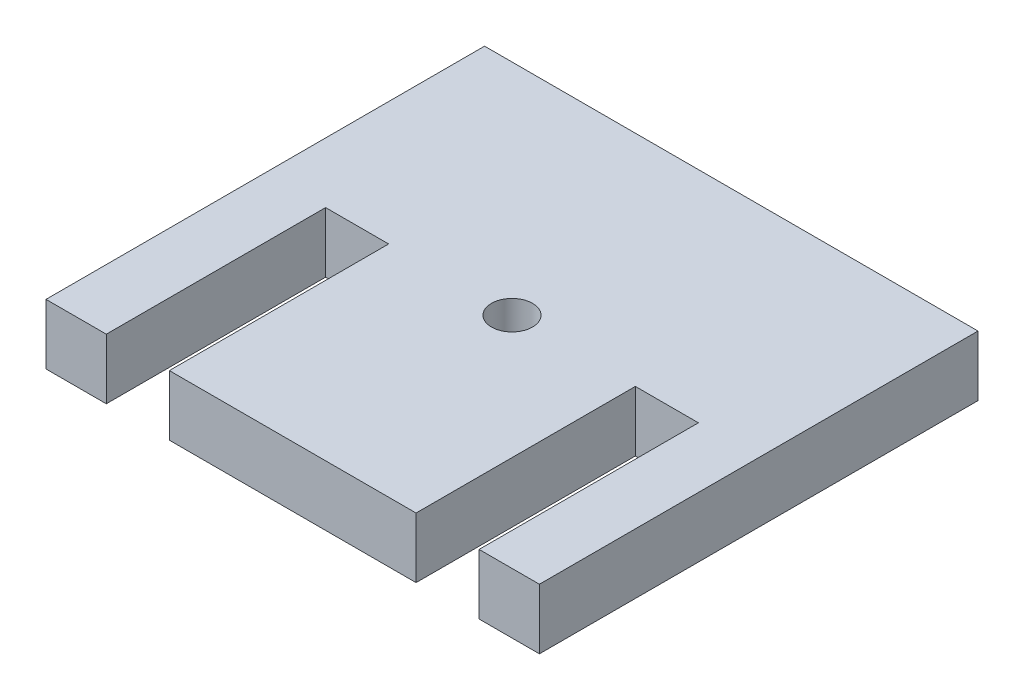
ISO-10303-21;
HEADER;
FILE_DESCRIPTION(('STEP AP214'),'2;1');
FILE_NAME('part.step','',(''),(''),'','','');
FILE_SCHEMA(('AUTOMOTIVE_DESIGN { 1 0 10303 214 1 1 1 1 }'));
ENDSEC;
DATA;
#1=APPLICATION_CONTEXT('core data for automotive mechanical design processes');
#2=APPLICATION_PROTOCOL_DEFINITION('international standard','automotive_design',2000,#1);
#3=PRODUCT_CONTEXT('',#1,'mechanical');
#4=PRODUCT('Part','Part','',(#3));
#5=PRODUCT_RELATED_PRODUCT_CATEGORY('part','',(#4));
#6=PRODUCT_DEFINITION_FORMATION('','',#4);
#7=PRODUCT_DEFINITION_CONTEXT('part definition',#1,'design');
#8=PRODUCT_DEFINITION('design','',#6,#7);
#9=PRODUCT_DEFINITION_SHAPE('','',#8);
#10=(LENGTH_UNIT() NAMED_UNIT(*) SI_UNIT(.MILLI.,.METRE.));
#11=(NAMED_UNIT(*) PLANE_ANGLE_UNIT() SI_UNIT($,.RADIAN.));
#12=(NAMED_UNIT(*) SI_UNIT($,.STERADIAN.) SOLID_ANGLE_UNIT());
#13=UNCERTAINTY_MEASURE_WITH_UNIT(LENGTH_MEASURE(1.E-05),#10,'distance_accuracy_value','');
#14=(GEOMETRIC_REPRESENTATION_CONTEXT(3) GLOBAL_UNCERTAINTY_ASSIGNED_CONTEXT((#13)) GLOBAL_UNIT_ASSIGNED_CONTEXT((#10,
#11,#12)) REPRESENTATION_CONTEXT('',''));
#15=CARTESIAN_POINT('',(0.,0.,0.));
#16=DIRECTION('',(0.,0.,1.));
#17=DIRECTION('',(1.,0.,0.));
#18=AXIS2_PLACEMENT_3D('',#15,#16,#17);
#19=CARTESIAN_POINT('',(65.4929153229643,2.2,0.));
#20=DIRECTION('',(1.,0.,0.));
#21=DIRECTION('',(0.,0.,-1.));
#22=AXIS2_PLACEMENT_3D('',#19,#20,#21);
#23=PLANE('',#22);
#24=DIRECTION('',(0.,0.,1.));
#25=VECTOR('',#24,1.);
#26=CARTESIAN_POINT('',(65.4929153229643,0.,0.));
#27=LINE('',#26,#25);
#28=CARTESIAN_POINT('',(65.4929153229643,0.,-15.5977127156666));
#29=VERTEX_POINT('',#28);
#30=CARTESIAN_POINT('',(65.4929153229643,0.,0.402287284333461));
#31=VERTEX_POINT('',#30);
#32=EDGE_CURVE('E192',#29,#31,#27,.T.);
#33=ORIENTED_EDGE('',*,*,#32,.F.);
#34=DIRECTION('',(0.,-1.,0.));
#35=VECTOR('',#34,1.);
#36=CARTESIAN_POINT('',(65.4929153229643,2.2,-15.5977127156666));
#37=LINE('',#36,#35);
#38=CARTESIAN_POINT('',(65.4929153229643,2.2,-15.5977127156666));
#39=VERTEX_POINT('',#38);
#40=EDGE_CURVE('E11',#39,#29,#37,.T.);
#41=ORIENTED_EDGE('',*,*,#40,.F.);
#42=DIRECTION('',(0.,0.,1.));
#43=VECTOR('',#42,1.);
#44=CARTESIAN_POINT('',(65.4929153229643,2.2,0.));
#45=LINE('',#44,#43);
#46=CARTESIAN_POINT('',(65.4929153229643,2.2,0.402287284333461));
#47=VERTEX_POINT('',#46);
#48=EDGE_CURVE('E274',#39,#47,#45,.T.);
#49=ORIENTED_EDGE('',*,*,#48,.T.);
#50=DIRECTION('',(0.,-1.,0.));
#51=VECTOR('',#50,1.);
#52=CARTESIAN_POINT('',(65.4929153229643,2.2,0.402287284333461));
#53=LINE('',#52,#51);
#54=EDGE_CURVE('E100',#47,#31,#53,.T.);
#55=ORIENTED_EDGE('',*,*,#54,.T.);
#56=EDGE_LOOP('',(#33,#41,#49,#55));
#57=FACE_BOUND('',#56,.T.);
#58=ADVANCED_FACE('F37',(#57),#23,.T.);
#59=CARTESIAN_POINT('',(0.,2.2,-15.5977127156666));
#60=DIRECTION('',(0.,0.,-1.));
#61=DIRECTION('',(-1.,0.,0.));
#62=AXIS2_PLACEMENT_3D('',#59,#60,#61);
#63=PLANE('',#62);
#64=DIRECTION('',(1.,0.,0.));
#65=VECTOR('',#64,1.);
#66=CARTESIAN_POINT('',(0.,0.,-15.5977127156666));
#67=LINE('',#66,#65);
#68=CARTESIAN_POINT('',(47.4929153229643,0.,-15.5977127156666));
#69=VERTEX_POINT('',#68);
#70=EDGE_CURVE('E186',#69,#29,#67,.T.);
#71=ORIENTED_EDGE('',*,*,#70,.F.);
#72=DIRECTION('',(0.,-1.,0.));
#73=VECTOR('',#72,1.);
#74=CARTESIAN_POINT('',(47.4929153229643,2.2,-15.5977127156666));
#75=LINE('',#74,#73);
#76=CARTESIAN_POINT('',(47.4929153229643,2.2,-15.5977127156666));
#77=VERTEX_POINT('',#76);
#78=EDGE_CURVE('E46',#77,#69,#75,.T.);
#79=ORIENTED_EDGE('',*,*,#78,.F.);
#80=DIRECTION('',(1.,0.,0.));
#81=VECTOR('',#80,1.);
#82=CARTESIAN_POINT('',(0.,2.2,-15.5977127156666));
#83=LINE('',#82,#81);
#84=EDGE_CURVE('E276',#77,#39,#83,.T.);
#85=ORIENTED_EDGE('',*,*,#84,.T.);
#86=ORIENTED_EDGE('',*,*,#40,.T.);
#87=EDGE_LOOP('',(#71,#79,#85,#86));
#88=FACE_BOUND('',#87,.T.);
#89=ADVANCED_FACE('F191',(#88),#63,.T.);
#90=CARTESIAN_POINT('',(47.4929153229643,2.2,0.));
#91=DIRECTION('',(1.,0.,0.));
#92=DIRECTION('',(0.,0.,-1.));
#93=AXIS2_PLACEMENT_3D('',#90,#91,#92);
#94=PLANE('',#93);
#95=DIRECTION('',(0.,0.,1.));
#96=VECTOR('',#95,1.);
#97=CARTESIAN_POINT('',(47.4929153229643,0.,0.));
#98=LINE('',#97,#96);
#99=CARTESIAN_POINT('',(47.4929153229643,0.,0.402287284333461));
#100=VERTEX_POINT('',#99);
#101=EDGE_CURVE('E177',#69,#100,#98,.T.);
#102=ORIENTED_EDGE('',*,*,#101,.T.);
#103=DIRECTION('',(0.,-1.,0.));
#104=VECTOR('',#103,1.);
#105=CARTESIAN_POINT('',(47.4929153229643,2.2,0.402287284333461));
#106=LINE('',#105,#104);
#107=CARTESIAN_POINT('',(47.4929153229643,2.2,0.402287284333461));
#108=VERTEX_POINT('',#107);
#109=EDGE_CURVE('E169',#108,#100,#106,.T.);
#110=ORIENTED_EDGE('',*,*,#109,.F.);
#111=DIRECTION('',(0.,0.,1.));
#112=VECTOR('',#111,1.);
#113=CARTESIAN_POINT('',(47.4929153229643,2.2,0.));
#114=LINE('',#113,#112);
#115=EDGE_CURVE('E179',#77,#108,#114,.T.);
#116=ORIENTED_EDGE('',*,*,#115,.F.);
#117=ORIENTED_EDGE('',*,*,#78,.T.);
#118=EDGE_LOOP('',(#102,#110,#116,#117));
#119=FACE_BOUND('',#118,.T.);
#120=ADVANCED_FACE('F175',(#119),#94,.F.);
#121=CARTESIAN_POINT('',(0.,2.2,0.402287284333461));
#122=DIRECTION('',(0.,0.,-1.));
#123=DIRECTION('',(-1.,0.,0.));
#124=AXIS2_PLACEMENT_3D('',#121,#122,#123);
#125=PLANE('',#124);
#126=DIRECTION('',(1.,0.,0.));
#127=VECTOR('',#126,1.);
#128=CARTESIAN_POINT('',(0.,0.,0.402287284333461));
#129=LINE('',#128,#127);
#130=CARTESIAN_POINT('',(49.6929153229643,0.,0.402287284333461));
#131=VERTEX_POINT('',#130);
#132=EDGE_CURVE('E189',#100,#131,#129,.T.);
#133=ORIENTED_EDGE('',*,*,#132,.T.);
#134=DIRECTION('',(0.,-1.,0.));
#135=VECTOR('',#134,1.);
#136=CARTESIAN_POINT('',(49.6929153229643,2.2,0.402287284333461));
#137=LINE('',#136,#135);
#138=CARTESIAN_POINT('',(49.6929153229643,2.2,0.402287284333461));
#139=VERTEX_POINT('',#138);
#140=EDGE_CURVE('E167',#139,#131,#137,.T.);
#141=ORIENTED_EDGE('',*,*,#140,.F.);
#142=DIRECTION('',(1.,0.,0.));
#143=VECTOR('',#142,1.);
#144=CARTESIAN_POINT('',(0.,2.2,0.402287284333461));
#145=LINE('',#144,#143);
#146=EDGE_CURVE('E281',#108,#139,#145,.T.);
#147=ORIENTED_EDGE('',*,*,#146,.F.);
#148=ORIENTED_EDGE('',*,*,#109,.T.);
#149=EDGE_LOOP('',(#133,#141,#147,#148));
#150=FACE_BOUND('',#149,.T.);
#151=ADVANCED_FACE('F241',(#150),#125,.F.);
#152=CARTESIAN_POINT('',(49.6929153229643,2.2,0.));
#153=DIRECTION('',(1.,0.,0.));
#154=DIRECTION('',(0.,0.,-1.));
#155=AXIS2_PLACEMENT_3D('',#152,#153,#154);
#156=PLANE('',#155);
#157=DIRECTION('',(0.,0.,1.));
#158=VECTOR('',#157,1.);
#159=CARTESIAN_POINT('',(49.6929153229643,0.,0.));
#160=LINE('',#159,#158);
#161=CARTESIAN_POINT('',(49.6929153229643,0.,-7.59771271566655));
#162=VERTEX_POINT('',#161);
#163=EDGE_CURVE('E199',#162,#131,#160,.T.);
#164=ORIENTED_EDGE('',*,*,#163,.F.);
#165=DIRECTION('',(0.,-1.,0.));
#166=VECTOR('',#165,1.);
#167=CARTESIAN_POINT('',(49.6929153229643,2.2,-7.59771271566655));
#168=LINE('',#167,#166);
#169=CARTESIAN_POINT('',(49.6929153229643,2.2,-7.59771271566655));
#170=VERTEX_POINT('',#169);
#171=EDGE_CURVE('E165',#170,#162,#168,.T.);
#172=ORIENTED_EDGE('',*,*,#171,.F.);
#173=DIRECTION('',(0.,0.,1.));
#174=VECTOR('',#173,1.);
#175=CARTESIAN_POINT('',(49.6929153229643,2.2,0.));
#176=LINE('',#175,#174);
#177=EDGE_CURVE('E283',#170,#139,#176,.T.);
#178=ORIENTED_EDGE('',*,*,#177,.T.);
#179=ORIENTED_EDGE('',*,*,#140,.T.);
#180=EDGE_LOOP('',(#164,#172,#178,#179));
#181=FACE_BOUND('',#180,.T.);
#182=ADVANCED_FACE('F244',(#181),#156,.T.);
#183=CARTESIAN_POINT('',(0.,2.2,-7.59771271566655));
#184=DIRECTION('',(0.,0.,-1.));
#185=DIRECTION('',(-1.,0.,0.));
#186=AXIS2_PLACEMENT_3D('',#183,#184,#185);
#187=PLANE('',#186);
#188=DIRECTION('',(1.,0.,0.));
#189=VECTOR('',#188,1.);
#190=CARTESIAN_POINT('',(0.,0.,-7.59771271566655));
#191=LINE('',#190,#189);
#192=CARTESIAN_POINT('',(51.9929153229643,0.,-7.59771271566655));
#193=VERTEX_POINT('',#192);
#194=EDGE_CURVE('E201',#162,#193,#191,.T.);
#195=ORIENTED_EDGE('',*,*,#194,.T.);
#196=DIRECTION('',(0.,-1.,0.));
#197=VECTOR('',#196,1.);
#198=CARTESIAN_POINT('',(51.9929153229643,2.2,-7.59771271566655));
#199=LINE('',#198,#197);
#200=CARTESIAN_POINT('',(51.9929153229643,2.2,-7.59771271566655));
#201=VERTEX_POINT('',#200);
#202=EDGE_CURVE('E162',#201,#193,#199,.T.);
#203=ORIENTED_EDGE('',*,*,#202,.F.);
#204=DIRECTION('',(1.,0.,0.));
#205=VECTOR('',#204,1.);
#206=CARTESIAN_POINT('',(0.,2.2,-7.59771271566655));
#207=LINE('',#206,#205);
#208=EDGE_CURVE('E286',#170,#201,#207,.T.);
#209=ORIENTED_EDGE('',*,*,#208,.F.);
#210=ORIENTED_EDGE('',*,*,#171,.T.);
#211=EDGE_LOOP('',(#195,#203,#209,#210));
#212=FACE_BOUND('',#211,.T.);
#213=ADVANCED_FACE('F248',(#212),#187,.F.);
#214=CARTESIAN_POINT('',(51.9929153229643,2.2,0.));
#215=DIRECTION('',(1.,0.,0.));
#216=DIRECTION('',(0.,0.,-1.));
#217=AXIS2_PLACEMENT_3D('',#214,#215,#216);
#218=PLANE('',#217);
#219=DIRECTION('',(0.,0.,1.));
#220=VECTOR('',#219,1.);
#221=CARTESIAN_POINT('',(51.9929153229643,0.,0.));
#222=LINE('',#221,#220);
#223=CARTESIAN_POINT('',(51.9929153229643,0.,0.402287284333461));
#224=VERTEX_POINT('',#223);
#225=EDGE_CURVE('E204',#193,#224,#222,.T.);
#226=ORIENTED_EDGE('',*,*,#225,.T.);
#227=DIRECTION('',(0.,-1.,0.));
#228=VECTOR('',#227,1.);
#229=CARTESIAN_POINT('',(51.9929153229643,2.2,0.402287284333461));
#230=LINE('',#229,#228);
#231=CARTESIAN_POINT('',(51.9929153229643,2.2,0.402287284333461));
#232=VERTEX_POINT('',#231);
#233=EDGE_CURVE('E159',#232,#224,#230,.T.);
#234=ORIENTED_EDGE('',*,*,#233,.F.);
#235=DIRECTION('',(0.,0.,1.));
#236=VECTOR('',#235,1.);
#237=CARTESIAN_POINT('',(51.9929153229643,2.2,0.));
#238=LINE('',#237,#236);
#239=EDGE_CURVE('E289',#201,#232,#238,.T.);
#240=ORIENTED_EDGE('',*,*,#239,.F.);
#241=ORIENTED_EDGE('',*,*,#202,.T.);
#242=EDGE_LOOP('',(#226,#234,#240,#241));
#243=FACE_BOUND('',#242,.T.);
#244=ADVANCED_FACE('F252',(#243),#218,.F.);
#245=CARTESIAN_POINT('',(0.,2.2,0.402287284333461));
#246=DIRECTION('',(0.,0.,-1.));
#247=DIRECTION('',(-1.,0.,0.));
#248=AXIS2_PLACEMENT_3D('',#245,#246,#247);
#249=PLANE('',#248);
#250=DIRECTION('',(1.,0.,0.));
#251=VECTOR('',#250,1.);
#252=CARTESIAN_POINT('',(0.,0.,0.402287284333461));
#253=LINE('',#252,#251);
#254=CARTESIAN_POINT('',(60.9929153229643,0.,0.402287284333461));
#255=VERTEX_POINT('',#254);
#256=EDGE_CURVE('E207',#224,#255,#253,.T.);
#257=ORIENTED_EDGE('',*,*,#256,.T.);
#258=DIRECTION('',(0.,-1.,0.));
#259=VECTOR('',#258,1.);
#260=CARTESIAN_POINT('',(60.9929153229643,2.2,0.402287284333461));
#261=LINE('',#260,#259);
#262=CARTESIAN_POINT('',(60.9929153229643,2.2,0.402287284333461));
#263=VERTEX_POINT('',#262);
#264=EDGE_CURVE('E153',#263,#255,#261,.T.);
#265=ORIENTED_EDGE('',*,*,#264,.F.);
#266=DIRECTION('',(1.,0.,0.));
#267=VECTOR('',#266,1.);
#268=CARTESIAN_POINT('',(0.,2.2,0.402287284333461));
#269=LINE('',#268,#267);
#270=EDGE_CURVE('E292',#232,#263,#269,.T.);
#271=ORIENTED_EDGE('',*,*,#270,.F.);
#272=ORIENTED_EDGE('',*,*,#233,.T.);
#273=EDGE_LOOP('',(#257,#265,#271,#272));
#274=FACE_BOUND('',#273,.T.);
#275=ADVANCED_FACE('F256',(#274),#249,.F.);
#276=CARTESIAN_POINT('',(60.9929153229643,2.2,0.));
#277=DIRECTION('',(1.,0.,0.));
#278=DIRECTION('',(0.,0.,-1.));
#279=AXIS2_PLACEMENT_3D('',#276,#277,#278);
#280=PLANE('',#279);
#281=DIRECTION('',(0.,0.,1.));
#282=VECTOR('',#281,1.);
#283=CARTESIAN_POINT('',(60.9929153229643,0.,0.));
#284=LINE('',#283,#282);
#285=CARTESIAN_POINT('',(60.9929153229643,0.,-7.59771271566655));
#286=VERTEX_POINT('',#285);
#287=EDGE_CURVE('E210',#286,#255,#284,.T.);
#288=ORIENTED_EDGE('',*,*,#287,.F.);
#289=DIRECTION('',(0.,-1.,0.));
#290=VECTOR('',#289,1.);
#291=CARTESIAN_POINT('',(60.9929153229643,2.2,-7.59771271566655));
#292=LINE('',#291,#290);
#293=CARTESIAN_POINT('',(60.9929153229643,2.2,-7.59771271566655));
#294=VERTEX_POINT('',#293);
#295=EDGE_CURVE('E151',#294,#286,#292,.T.);
#296=ORIENTED_EDGE('',*,*,#295,.F.);
#297=DIRECTION('',(0.,0.,1.));
#298=VECTOR('',#297,1.);
#299=CARTESIAN_POINT('',(60.9929153229643,2.2,0.));
#300=LINE('',#299,#298);
#301=EDGE_CURVE('E145',#294,#263,#300,.T.);
#302=ORIENTED_EDGE('',*,*,#301,.T.);
#303=ORIENTED_EDGE('',*,*,#264,.T.);
#304=EDGE_LOOP('',(#288,#296,#302,#303));
#305=FACE_BOUND('',#304,.T.);
#306=ADVANCED_FACE('F260',(#305),#280,.T.);
#307=CARTESIAN_POINT('',(0.,2.2,-7.59771271566655));
#308=DIRECTION('',(0.,0.,-1.));
#309=DIRECTION('',(-1.,0.,0.));
#310=AXIS2_PLACEMENT_3D('',#307,#308,#309);
#311=PLANE('',#310);
#312=DIRECTION('',(1.,0.,0.));
#313=VECTOR('',#312,1.);
#314=CARTESIAN_POINT('',(0.,0.,-7.59771271566655));
#315=LINE('',#314,#313);
#316=CARTESIAN_POINT('',(63.2929153229643,0.,-7.59771271566655));
#317=VERTEX_POINT('',#316);
#318=EDGE_CURVE('E150',#286,#317,#315,.T.);
#319=ORIENTED_EDGE('',*,*,#318,.T.);
#320=DIRECTION('',(0.,-1.,0.));
#321=VECTOR('',#320,1.);
#322=CARTESIAN_POINT('',(63.2929153229643,2.2,-7.59771271566655));
#323=LINE('',#322,#321);
#324=CARTESIAN_POINT('',(63.2929153229643,2.2,-7.59771271566655));
#325=VERTEX_POINT('',#324);
#326=EDGE_CURVE('E136',#325,#317,#323,.T.);
#327=ORIENTED_EDGE('',*,*,#326,.F.);
#328=DIRECTION('',(1.,0.,0.));
#329=VECTOR('',#328,1.);
#330=CARTESIAN_POINT('',(0.,2.2,-7.59771271566655));
#331=LINE('',#330,#329);
#332=EDGE_CURVE('E139',#294,#325,#331,.T.);
#333=ORIENTED_EDGE('',*,*,#332,.F.);
#334=ORIENTED_EDGE('',*,*,#295,.T.);
#335=EDGE_LOOP('',(#319,#327,#333,#334));
#336=FACE_BOUND('',#335,.T.);
#337=ADVANCED_FACE('F148',(#336),#311,.F.);
#338=CARTESIAN_POINT('',(63.2929153229643,2.2,0.));
#339=DIRECTION('',(1.,0.,0.));
#340=DIRECTION('',(0.,0.,-1.));
#341=AXIS2_PLACEMENT_3D('',#338,#339,#340);
#342=PLANE('',#341);
#343=DIRECTION('',(0.,0.,1.));
#344=VECTOR('',#343,1.);
#345=CARTESIAN_POINT('',(63.2929153229643,0.,0.));
#346=LINE('',#345,#344);
#347=CARTESIAN_POINT('',(63.2929153229643,0.,0.402287284333461));
#348=VERTEX_POINT('',#347);
#349=EDGE_CURVE('E214',#317,#348,#346,.T.);
#350=ORIENTED_EDGE('',*,*,#349,.T.);
#351=DIRECTION('',(0.,-1.,0.));
#352=VECTOR('',#351,1.);
#353=CARTESIAN_POINT('',(63.2929153229643,2.2,0.402287284333461));
#354=LINE('',#353,#352);
#355=CARTESIAN_POINT('',(63.2929153229643,2.2,0.402287284333461));
#356=VERTEX_POINT('',#355);
#357=EDGE_CURVE('E138',#356,#348,#354,.T.);
#358=ORIENTED_EDGE('',*,*,#357,.F.);
#359=DIRECTION('',(0.,0.,1.));
#360=VECTOR('',#359,1.);
#361=CARTESIAN_POINT('',(63.2929153229643,2.2,0.));
#362=LINE('',#361,#360);
#363=EDGE_CURVE('E131',#325,#356,#362,.T.);
#364=ORIENTED_EDGE('',*,*,#363,.F.);
#365=ORIENTED_EDGE('',*,*,#326,.T.);
#366=EDGE_LOOP('',(#350,#358,#364,#365));
#367=FACE_BOUND('',#366,.T.);
#368=ADVANCED_FACE('F134',(#367),#342,.F.);
#369=CARTESIAN_POINT('',(56.4929153229643,2.2,-7.59771271566655));
#370=DIRECTION('',(0.,-1.,0.));
#371=DIRECTION('',(0.,0.,-1.));
#372=AXIS2_PLACEMENT_3D('',#369,#370,#371);
#373=CYLINDRICAL_SURFACE('',#372,0.750000000000012);
#374=CARTESIAN_POINT('',(56.4929153229643,2.2,-7.59771271566655));
#375=DIRECTION('',(0.,1.,0.));
#376=DIRECTION('',(0.,0.,1.));
#377=AXIS2_PLACEMENT_3D('',#374,#375,#376);
#378=CIRCLE('',#377,0.750000000000012);
#379=CARTESIAN_POINT('',(56.4929153229643,2.2,-6.84771271566653));
#380=VERTEX_POINT('',#379);
#381=EDGE_CURVE('E216',#380,#380,#378,.T.);
#382=ORIENTED_EDGE('',*,*,#381,.T.);
#383=EDGE_LOOP('',(#382));
#384=FACE_BOUND('',#383,.T.);
#385=CARTESIAN_POINT('',(56.4929153229643,0.,-7.59771271566655));
#386=DIRECTION('',(0.,1.,0.));
#387=DIRECTION('',(0.,0.,1.));
#388=AXIS2_PLACEMENT_3D('',#385,#386,#387);
#389=CIRCLE('',#388,0.750000000000012);
#390=CARTESIAN_POINT('',(56.4929153229643,0.,-6.84771271566653));
#391=VERTEX_POINT('',#390);
#392=EDGE_CURVE('E194',#391,#391,#389,.T.);
#393=ORIENTED_EDGE('',*,*,#392,.F.);
#394=EDGE_LOOP('',(#393));
#395=FACE_BOUND('',#394,.T.);
#396=ADVANCED_FACE('F39',(#384,#395),#373,.F.);
#397=CARTESIAN_POINT('',(0.,2.2,0.402287284333461));
#398=DIRECTION('',(0.,0.,-1.));
#399=DIRECTION('',(-1.,0.,0.));
#400=AXIS2_PLACEMENT_3D('',#397,#398,#399);
#401=PLANE('',#400);
#402=DIRECTION('',(1.,0.,0.));
#403=VECTOR('',#402,1.);
#404=CARTESIAN_POINT('',(0.,0.,0.402287284333461));
#405=LINE('',#404,#403);
#406=EDGE_CURVE('E93',#348,#31,#405,.T.);
#407=ORIENTED_EDGE('',*,*,#406,.T.);
#408=ORIENTED_EDGE('',*,*,#54,.F.);
#409=DIRECTION('',(1.,0.,0.));
#410=VECTOR('',#409,1.);
#411=CARTESIAN_POINT('',(0.,2.2,0.402287284333461));
#412=LINE('',#411,#410);
#413=EDGE_CURVE('E54',#356,#47,#412,.T.);
#414=ORIENTED_EDGE('',*,*,#413,.F.);
#415=ORIENTED_EDGE('',*,*,#357,.T.);
#416=EDGE_LOOP('',(#407,#408,#414,#415));
#417=FACE_BOUND('',#416,.T.);
#418=ADVANCED_FACE('F223',(#417),#401,.F.);
#419=CARTESIAN_POINT('',(0.,2.2,0.));
#420=DIRECTION('',(0.,1.,0.));
#421=DIRECTION('',(0.,0.,1.));
#422=AXIS2_PLACEMENT_3D('',#419,#420,#421);
#423=PLANE('',#422);
#424=ORIENTED_EDGE('',*,*,#381,.F.);
#425=EDGE_LOOP('',(#424));
#426=FACE_BOUND('',#425,.T.);
#427=ORIENTED_EDGE('',*,*,#48,.F.);
#428=ORIENTED_EDGE('',*,*,#84,.F.);
#429=ORIENTED_EDGE('',*,*,#115,.T.);
#430=ORIENTED_EDGE('',*,*,#146,.T.);
#431=ORIENTED_EDGE('',*,*,#177,.F.);
#432=ORIENTED_EDGE('',*,*,#208,.T.);
#433=ORIENTED_EDGE('',*,*,#239,.T.);
#434=ORIENTED_EDGE('',*,*,#270,.T.);
#435=ORIENTED_EDGE('',*,*,#301,.F.);
#436=ORIENTED_EDGE('',*,*,#332,.T.);
#437=ORIENTED_EDGE('',*,*,#363,.T.);
#438=ORIENTED_EDGE('',*,*,#413,.T.);
#439=EDGE_LOOP('',(#427,#428,#429,#430,#431,#432,#433,#434,#435,#436,#437,#438));
#440=FACE_BOUND('',#439,.T.);
#441=ADVANCED_FACE('F143',(#426,#440),#423,.T.);
#442=CARTESIAN_POINT('',(0.,0.,0.));
#443=DIRECTION('',(0.,1.,0.));
#444=DIRECTION('',(0.,0.,1.));
#445=AXIS2_PLACEMENT_3D('',#442,#443,#444);
#446=PLANE('',#445);
#447=ORIENTED_EDGE('',*,*,#392,.T.);
#448=EDGE_LOOP('',(#447));
#449=FACE_BOUND('',#448,.T.);
#450=ORIENTED_EDGE('',*,*,#32,.T.);
#451=ORIENTED_EDGE('',*,*,#406,.F.);
#452=ORIENTED_EDGE('',*,*,#349,.F.);
#453=ORIENTED_EDGE('',*,*,#318,.F.);
#454=ORIENTED_EDGE('',*,*,#287,.T.);
#455=ORIENTED_EDGE('',*,*,#256,.F.);
#456=ORIENTED_EDGE('',*,*,#225,.F.);
#457=ORIENTED_EDGE('',*,*,#194,.F.);
#458=ORIENTED_EDGE('',*,*,#163,.T.);
#459=ORIENTED_EDGE('',*,*,#132,.F.);
#460=ORIENTED_EDGE('',*,*,#101,.F.);
#461=ORIENTED_EDGE('',*,*,#70,.T.);
#462=EDGE_LOOP('',(#450,#451,#452,#453,#454,#455,#456,#457,#458,#459,#460,#461));
#463=FACE_BOUND('',#462,.T.);
#464=ADVANCED_FACE('F185',(#449,#463),#446,.F.);
#465=CLOSED_SHELL('',(#58,#89,#120,#151,#182,#213,#244,#275,#306,#337,#368,#396,#418,#441,#464));
#466=MANIFOLD_SOLID_BREP('B2',#465);
#467=ADVANCED_BREP_SHAPE_REPRESENTATION('',(#18,#466),#14);
#468=SHAPE_DEFINITION_REPRESENTATION(#9,#467);
ENDSEC;
END-ISO-10303-21;
